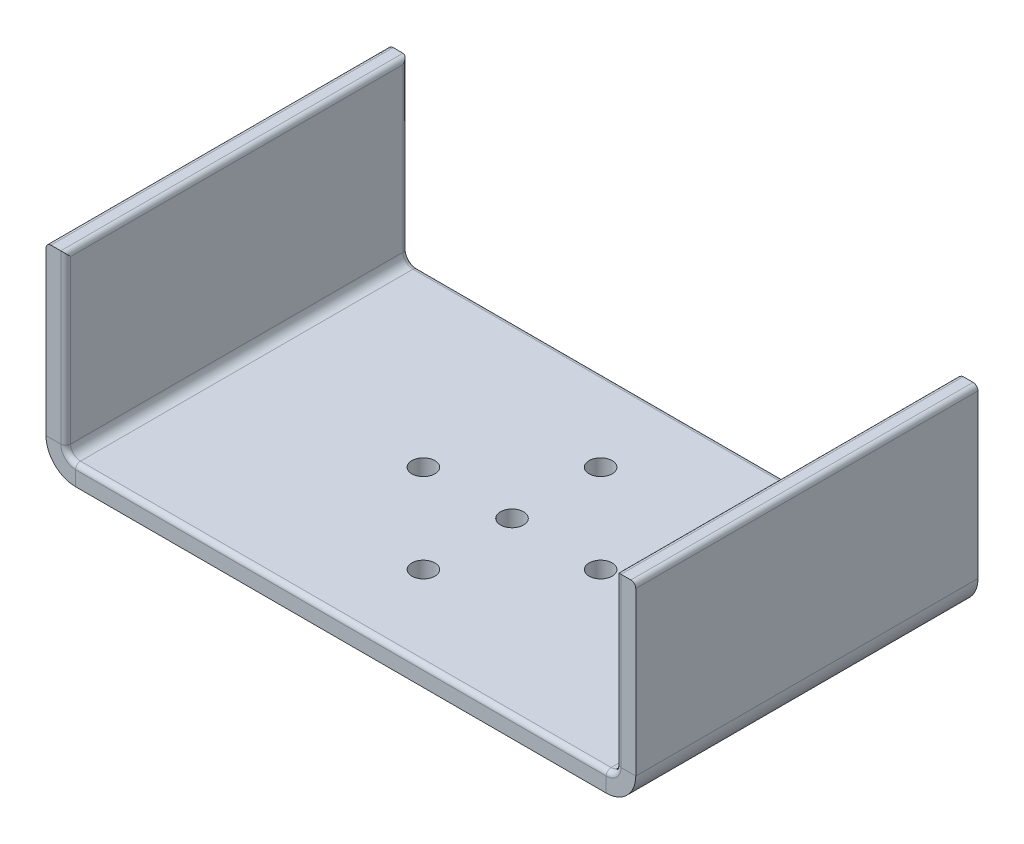
ISO-10303-21;
HEADER;
FILE_DESCRIPTION(('STEP AP214'),'2;1');
FILE_NAME('part.step','',(''),(''),'','','');
FILE_SCHEMA(('AUTOMOTIVE_DESIGN { 1 0 10303 214 1 1 1 1 }'));
ENDSEC;
DATA;
#1=APPLICATION_CONTEXT('core data for automotive mechanical design processes');
#2=APPLICATION_PROTOCOL_DEFINITION('international standard','automotive_design',2000,#1);
#3=PRODUCT_CONTEXT('',#1,'mechanical');
#4=PRODUCT('Part','Part','',(#3));
#5=PRODUCT_RELATED_PRODUCT_CATEGORY('part','',(#4));
#6=PRODUCT_DEFINITION_FORMATION('','',#4);
#7=PRODUCT_DEFINITION_CONTEXT('part definition',#1,'design');
#8=PRODUCT_DEFINITION('design','',#6,#7);
#9=PRODUCT_DEFINITION_SHAPE('','',#8);
#10=(LENGTH_UNIT() NAMED_UNIT(*) SI_UNIT(.MILLI.,.METRE.));
#11=(NAMED_UNIT(*) PLANE_ANGLE_UNIT() SI_UNIT($,.RADIAN.));
#12=(NAMED_UNIT(*) SI_UNIT($,.STERADIAN.) SOLID_ANGLE_UNIT());
#13=UNCERTAINTY_MEASURE_WITH_UNIT(LENGTH_MEASURE(1.E-05),#10,'distance_accuracy_value','');
#14=(GEOMETRIC_REPRESENTATION_CONTEXT(3) GLOBAL_UNCERTAINTY_ASSIGNED_CONTEXT((#13)) GLOBAL_UNIT_ASSIGNED_CONTEXT((#10,
#11,#12)) REPRESENTATION_CONTEXT('',''));
#15=CARTESIAN_POINT('',(0.,0.,0.));
#16=DIRECTION('',(0.,0.,1.));
#17=DIRECTION('',(1.,0.,0.));
#18=AXIS2_PLACEMENT_3D('',#15,#16,#17);
#19=CARTESIAN_POINT('',(0.,-2.,0.));
#20=DIRECTION('',(0.,1.,0.));
#21=DIRECTION('',(0.,0.,1.));
#22=AXIS2_PLACEMENT_3D('',#19,#20,#21);
#23=PLANE('',#22);
#24=CARTESIAN_POINT('',(-9.,-2.,0.));
#25=DIRECTION('',(0.,1.,0.));
#26=DIRECTION('',(0.,0.,1.));
#27=AXIS2_PLACEMENT_3D('',#24,#25,#26);
#28=CIRCLE('',#27,1.17000000000009);
#29=CARTESIAN_POINT('',(-9.,-2.,1.17000000000009));
#30=VERTEX_POINT('',#29);
#31=EDGE_CURVE('E824',#30,#30,#28,.T.);
#32=ORIENTED_EDGE('',*,*,#31,.T.);
#33=EDGE_LOOP('',(#32));
#34=FACE_BOUND('',#33,.T.);
#35=CARTESIAN_POINT('',(0.,-2.,9.));
#36=DIRECTION('',(0.,1.,0.));
#37=DIRECTION('',(0.,0.,1.));
#38=AXIS2_PLACEMENT_3D('',#35,#36,#37);
#39=CIRCLE('',#38,1.17000000000006);
#40=CARTESIAN_POINT('',(0.,-2.,10.1700000000001));
#41=VERTEX_POINT('',#40);
#42=EDGE_CURVE('E826',#41,#41,#39,.T.);
#43=ORIENTED_EDGE('',*,*,#42,.T.);
#44=EDGE_LOOP('',(#43));
#45=FACE_BOUND('',#44,.T.);
#46=CARTESIAN_POINT('',(9.,-2.,0.));
#47=DIRECTION('',(0.,1.,0.));
#48=DIRECTION('',(0.,0.,1.));
#49=AXIS2_PLACEMENT_3D('',#46,#47,#48);
#50=CIRCLE('',#49,1.17000000000003);
#51=CARTESIAN_POINT('',(9.,-2.,1.17000000000003));
#52=VERTEX_POINT('',#51);
#53=EDGE_CURVE('E831',#52,#52,#50,.T.);
#54=ORIENTED_EDGE('',*,*,#53,.T.);
#55=EDGE_LOOP('',(#54));
#56=FACE_BOUND('',#55,.T.);
#57=CARTESIAN_POINT('',(0.,-2.,-9.));
#58=DIRECTION('',(0.,1.,0.));
#59=DIRECTION('',(0.,0.,1.));
#60=AXIS2_PLACEMENT_3D('',#57,#58,#59);
#61=CIRCLE('',#60,1.17);
#62=CARTESIAN_POINT('',(0.,-2.,-7.83));
#63=VERTEX_POINT('',#62);
#64=EDGE_CURVE('E841',#63,#63,#61,.T.);
#65=ORIENTED_EDGE('',*,*,#64,.T.);
#66=EDGE_LOOP('',(#65));
#67=FACE_BOUND('',#66,.T.);
#68=CARTESIAN_POINT('',(0.,-2.,0.));
#69=DIRECTION('',(0.,1.,0.));
#70=DIRECTION('',(0.,0.,1.));
#71=AXIS2_PLACEMENT_3D('',#68,#69,#70);
#72=CIRCLE('',#71,1.17);
#73=CARTESIAN_POINT('',(0.,-2.,1.17));
#74=VERTEX_POINT('',#73);
#75=EDGE_CURVE('E380',#74,#74,#72,.T.);
#76=ORIENTED_EDGE('',*,*,#75,.T.);
#77=EDGE_LOOP('',(#76));
#78=FACE_BOUND('',#77,.T.);
#79=DIRECTION('',(0.,0.,-1.));
#80=VECTOR('',#79,1.);
#81=CARTESIAN_POINT('',(26.95,-2.00000000000001,-17.38));
#82=LINE('',#81,#80);
#83=CARTESIAN_POINT('',(26.95,-2.00000000000001,-17.38));
#84=VERTEX_POINT('',#83);
#85=CARTESIAN_POINT('',(26.95,-2.,17.38));
#86=VERTEX_POINT('',#85);
#87=EDGE_CURVE('E240',#84,#86,#82,.F.);
#88=ORIENTED_EDGE('',*,*,#87,.T.);
#89=DIRECTION('',(1.,0.,0.));
#90=VECTOR('',#89,1.);
#91=CARTESIAN_POINT('',(-29.95,-2.,17.38));
#92=LINE('',#91,#90);
#93=CARTESIAN_POINT('',(-26.95,-2.,17.38));
#94=VERTEX_POINT('',#93);
#95=EDGE_CURVE('E309',#94,#86,#92,.T.);
#96=ORIENTED_EDGE('',*,*,#95,.F.);
#97=DIRECTION('',(0.,0.,1.));
#98=VECTOR('',#97,1.);
#99=CARTESIAN_POINT('',(-26.95,-2.,17.38));
#100=LINE('',#99,#98);
#101=CARTESIAN_POINT('',(-26.95,-2.,-17.38));
#102=VERTEX_POINT('',#101);
#103=EDGE_CURVE('E295',#94,#102,#100,.F.);
#104=ORIENTED_EDGE('',*,*,#103,.T.);
#105=DIRECTION('',(-1.,0.,0.));
#106=VECTOR('',#105,1.);
#107=CARTESIAN_POINT('',(-29.95,-2.,-17.38));
#108=LINE('',#107,#106);
#109=EDGE_CURVE('E313',#84,#102,#108,.T.);
#110=ORIENTED_EDGE('',*,*,#109,.F.);
#111=EDGE_LOOP('',(#88,#96,#104,#110));
#112=FACE_BOUND('',#111,.T.);
#113=ADVANCED_FACE('F80',(#34,#45,#56,#67,#78,#112),#23,.F.);
#114=CARTESIAN_POINT('',(0.,0.,0.));
#115=DIRECTION('',(0.,1.,0.));
#116=DIRECTION('',(0.,0.,1.));
#117=AXIS2_PLACEMENT_3D('',#114,#115,#116);
#118=PLANE('',#117);
#119=CARTESIAN_POINT('',(-9.,0.,0.));
#120=DIRECTION('',(0.,1.,0.));
#121=DIRECTION('',(0.,0.,1.));
#122=AXIS2_PLACEMENT_3D('',#119,#120,#121);
#123=CIRCLE('',#122,1.17000000000009);
#124=CARTESIAN_POINT('',(-9.,0.,1.17000000000009));
#125=VERTEX_POINT('',#124);
#126=EDGE_CURVE('E822',#125,#125,#123,.T.);
#127=ORIENTED_EDGE('',*,*,#126,.F.);
#128=EDGE_LOOP('',(#127));
#129=FACE_BOUND('',#128,.T.);
#130=CARTESIAN_POINT('',(0.,0.,9.));
#131=DIRECTION('',(0.,1.,0.));
#132=DIRECTION('',(0.,0.,1.));
#133=AXIS2_PLACEMENT_3D('',#130,#131,#132);
#134=CIRCLE('',#133,1.17000000000006);
#135=CARTESIAN_POINT('',(0.,0.,10.1700000000001));
#136=VERTEX_POINT('',#135);
#137=EDGE_CURVE('E848',#136,#136,#134,.T.);
#138=ORIENTED_EDGE('',*,*,#137,.F.);
#139=EDGE_LOOP('',(#138));
#140=FACE_BOUND('',#139,.T.);
#141=CARTESIAN_POINT('',(9.,0.,0.));
#142=DIRECTION('',(0.,1.,0.));
#143=DIRECTION('',(0.,0.,1.));
#144=AXIS2_PLACEMENT_3D('',#141,#142,#143);
#145=CIRCLE('',#144,1.17000000000003);
#146=CARTESIAN_POINT('',(9.,0.,1.17000000000003));
#147=VERTEX_POINT('',#146);
#148=EDGE_CURVE('E845',#147,#147,#145,.T.);
#149=ORIENTED_EDGE('',*,*,#148,.F.);
#150=EDGE_LOOP('',(#149));
#151=FACE_BOUND('',#150,.T.);
#152=CARTESIAN_POINT('',(0.,0.,-9.));
#153=DIRECTION('',(0.,1.,0.));
#154=DIRECTION('',(0.,0.,1.));
#155=AXIS2_PLACEMENT_3D('',#152,#153,#154);
#156=CIRCLE('',#155,1.17);
#157=CARTESIAN_POINT('',(0.,0.,-7.83));
#158=VERTEX_POINT('',#157);
#159=EDGE_CURVE('E844',#158,#158,#156,.T.);
#160=ORIENTED_EDGE('',*,*,#159,.F.);
#161=EDGE_LOOP('',(#160));
#162=FACE_BOUND('',#161,.T.);
#163=CARTESIAN_POINT('',(0.,0.,0.));
#164=DIRECTION('',(0.,1.,0.));
#165=DIRECTION('',(0.,0.,1.));
#166=AXIS2_PLACEMENT_3D('',#163,#164,#165);
#167=CIRCLE('',#166,1.17);
#168=CARTESIAN_POINT('',(0.,0.,1.17));
#169=VERTEX_POINT('',#168);
#170=EDGE_CURVE('E825',#169,#169,#167,.T.);
#171=ORIENTED_EDGE('',*,*,#170,.F.);
#172=EDGE_LOOP('',(#171));
#173=FACE_BOUND('',#172,.T.);
#174=DIRECTION('',(0.,0.,-1.));
#175=VECTOR('',#174,1.);
#176=CARTESIAN_POINT('',(26.95,0.,-17.38));
#177=LINE('',#176,#175);
#178=CARTESIAN_POINT('',(26.95,0.,-16.88));
#179=VERTEX_POINT('',#178);
#180=CARTESIAN_POINT('',(26.95,0.,16.88));
#181=VERTEX_POINT('',#180);
#182=EDGE_CURVE('E241',#179,#181,#177,.F.);
#183=ORIENTED_EDGE('',*,*,#182,.F.);
#184=DIRECTION('',(-1.,0.,0.));
#185=VECTOR('',#184,1.);
#186=CARTESIAN_POINT('',(0.,0.,-16.88));
#187=LINE('',#186,#185);
#188=CARTESIAN_POINT('',(-26.95,0.,-16.88));
#189=VERTEX_POINT('',#188);
#190=EDGE_CURVE('E336',#179,#189,#187,.T.);
#191=ORIENTED_EDGE('',*,*,#190,.T.);
#192=DIRECTION('',(0.,0.,1.));
#193=VECTOR('',#192,1.);
#194=CARTESIAN_POINT('',(-26.95,0.,17.38));
#195=LINE('',#194,#193);
#196=CARTESIAN_POINT('',(-26.95,0.,16.88));
#197=VERTEX_POINT('',#196);
#198=EDGE_CURVE('E276',#197,#189,#195,.F.);
#199=ORIENTED_EDGE('',*,*,#198,.F.);
#200=DIRECTION('',(1.,0.,0.));
#201=VECTOR('',#200,1.);
#202=CARTESIAN_POINT('',(0.,0.,16.88));
#203=LINE('',#202,#201);
#204=EDGE_CURVE('E334',#197,#181,#203,.T.);
#205=ORIENTED_EDGE('',*,*,#204,.T.);
#206=EDGE_LOOP('',(#183,#191,#199,#205));
#207=FACE_BOUND('',#206,.T.);
#208=ADVANCED_FACE('F445',(#129,#140,#151,#162,#173,#207),#118,.T.);
#209=CARTESIAN_POINT('',(-29.95,-2.,-17.38));
#210=DIRECTION('',(0.,0.,-1.));
#211=DIRECTION('',(-1.,0.,0.));
#212=AXIS2_PLACEMENT_3D('',#209,#210,#211);
#213=PLANE('',#212);
#214=DIRECTION('',(0.,-1.,0.));
#215=VECTOR('',#214,1.);
#216=CARTESIAN_POINT('',(-26.95,0.,-17.38));
#217=LINE('',#216,#215);
#218=CARTESIAN_POINT('',(-26.95,-0.5,-17.38));
#219=VERTEX_POINT('',#218);
#220=EDGE_CURVE('E307',#219,#102,#217,.T.);
#221=ORIENTED_EDGE('',*,*,#220,.F.);
#222=DIRECTION('',(-1.,0.,0.));
#223=VECTOR('',#222,1.);
#224=CARTESIAN_POINT('',(-29.95,-0.5,-17.38));
#225=LINE('',#224,#223);
#226=CARTESIAN_POINT('',(26.95,-0.500000000000005,-17.38));
#227=VERTEX_POINT('',#226);
#228=EDGE_CURVE('E338',#219,#227,#225,.F.);
#229=ORIENTED_EDGE('',*,*,#228,.T.);
#230=DIRECTION('',(0.,-1.,0.));
#231=VECTOR('',#230,1.);
#232=CARTESIAN_POINT('',(26.95,0.,-17.38));
#233=LINE('',#232,#231);
#234=EDGE_CURVE('E265',#227,#84,#233,.T.);
#235=ORIENTED_EDGE('',*,*,#234,.T.);
#236=ORIENTED_EDGE('',*,*,#109,.T.);
#237=EDGE_LOOP('',(#221,#229,#235,#236));
#238=FACE_BOUND('',#237,.T.);
#239=ADVANCED_FACE('F491',(#238),#213,.T.);
#240=CARTESIAN_POINT('',(-29.95,-2.,17.38));
#241=DIRECTION('',(0.,0.,1.));
#242=DIRECTION('',(1.,0.,0.));
#243=AXIS2_PLACEMENT_3D('',#240,#241,#242);
#244=PLANE('',#243);
#245=DIRECTION('',(0.,-1.,0.));
#246=VECTOR('',#245,1.);
#247=CARTESIAN_POINT('',(26.95,0.,17.38));
#248=LINE('',#247,#246);
#249=CARTESIAN_POINT('',(26.95,-0.5,17.38));
#250=VERTEX_POINT('',#249);
#251=EDGE_CURVE('E269',#250,#86,#248,.T.);
#252=ORIENTED_EDGE('',*,*,#251,.F.);
#253=DIRECTION('',(1.,0.,0.));
#254=VECTOR('',#253,1.);
#255=CARTESIAN_POINT('',(-29.95,-0.5,17.38));
#256=LINE('',#255,#254);
#257=CARTESIAN_POINT('',(-26.95,-0.5,17.38));
#258=VERTEX_POINT('',#257);
#259=EDGE_CURVE('E13',#250,#258,#256,.F.);
#260=ORIENTED_EDGE('',*,*,#259,.T.);
#261=DIRECTION('',(0.,-1.,0.));
#262=VECTOR('',#261,1.);
#263=CARTESIAN_POINT('',(-26.95,0.,17.38));
#264=LINE('',#263,#262);
#265=EDGE_CURVE('E302',#258,#94,#264,.T.);
#266=ORIENTED_EDGE('',*,*,#265,.T.);
#267=ORIENTED_EDGE('',*,*,#95,.T.);
#268=EDGE_LOOP('',(#252,#260,#266,#267));
#269=FACE_BOUND('',#268,.T.);
#270=ADVANCED_FACE('F502',(#269),#244,.T.);
#271=CARTESIAN_POINT('',(-26.95,1.,-17.38));
#272=DIRECTION('',(0.,0.,-1.));
#273=DIRECTION('',(-1.,0.,0.));
#274=AXIS2_PLACEMENT_3D('',#271,#272,#273);
#275=PLANE('',#274);
#276=DIRECTION('',(1.,0.,0.));
#277=VECTOR('',#276,1.);
#278=CARTESIAN_POINT('',(-29.95,0.99999999999999,-17.38));
#279=LINE('',#278,#277);
#280=CARTESIAN_POINT('',(-28.45,0.999999999999996,-17.38));
#281=VERTEX_POINT('',#280);
#282=CARTESIAN_POINT('',(-29.95,0.99999999999999,-17.38));
#283=VERTEX_POINT('',#282);
#284=EDGE_CURVE('E271',#281,#283,#279,.F.);
#285=ORIENTED_EDGE('',*,*,#284,.F.);
#286=CARTESIAN_POINT('',(-26.95,1.,-17.38));
#287=DIRECTION('',(0.,0.,-1.));
#288=DIRECTION('',(-1.,0.,0.));
#289=AXIS2_PLACEMENT_3D('',#286,#287,#288);
#290=CIRCLE('',#289,1.5);
#291=EDGE_CURVE('E332',#281,#219,#290,.F.);
#292=ORIENTED_EDGE('',*,*,#291,.T.);
#293=ORIENTED_EDGE('',*,*,#220,.T.);
#294=CARTESIAN_POINT('',(-26.95,1.,-17.38));
#295=DIRECTION('',(0.,0.,1.));
#296=DIRECTION('',(1.,0.,0.));
#297=AXIS2_PLACEMENT_3D('',#294,#295,#296);
#298=CIRCLE('',#297,3.);
#299=EDGE_CURVE('E298',#102,#283,#298,.F.);
#300=ORIENTED_EDGE('',*,*,#299,.T.);
#301=EDGE_LOOP('',(#285,#292,#293,#300));
#302=FACE_BOUND('',#301,.T.);
#303=ADVANCED_FACE('F486',(#302),#275,.T.);
#304=CARTESIAN_POINT('',(-26.95,1.,17.38));
#305=DIRECTION('',(0.,0.,-1.));
#306=DIRECTION('',(-1.,0.,0.));
#307=AXIS2_PLACEMENT_3D('',#304,#305,#306);
#308=PLANE('',#307);
#309=ORIENTED_EDGE('',*,*,#265,.F.);
#310=CARTESIAN_POINT('',(-26.95,1.,17.38));
#311=DIRECTION('',(0.,0.,-1.));
#312=DIRECTION('',(-1.,0.,0.));
#313=AXIS2_PLACEMENT_3D('',#310,#311,#312);
#314=CIRCLE('',#313,1.5);
#315=CARTESIAN_POINT('',(-28.45,0.999999999999996,17.38));
#316=VERTEX_POINT('',#315);
#317=EDGE_CURVE('E349',#258,#316,#314,.T.);
#318=ORIENTED_EDGE('',*,*,#317,.T.);
#319=DIRECTION('',(1.,0.,0.));
#320=VECTOR('',#319,1.);
#321=CARTESIAN_POINT('',(-27.95,0.999999999999997,17.38));
#322=LINE('',#321,#320);
#323=CARTESIAN_POINT('',(-29.95,0.99999999999999,17.38));
#324=VERTEX_POINT('',#323);
#325=EDGE_CURVE('E288',#316,#324,#322,.F.);
#326=ORIENTED_EDGE('',*,*,#325,.T.);
#327=CARTESIAN_POINT('',(-26.95,1.,17.38));
#328=DIRECTION('',(0.,0.,1.));
#329=DIRECTION('',(1.,0.,0.));
#330=AXIS2_PLACEMENT_3D('',#327,#328,#329);
#331=CIRCLE('',#330,3.);
#332=EDGE_CURVE('E299',#324,#94,#331,.T.);
#333=ORIENTED_EDGE('',*,*,#332,.T.);
#334=EDGE_LOOP('',(#309,#318,#326,#333));
#335=FACE_BOUND('',#334,.T.);
#336=ADVANCED_FACE('F496',(#335),#308,.F.);
#337=CARTESIAN_POINT('',(-26.95,1.,17.38));
#338=DIRECTION('',(0.,0.,1.));
#339=DIRECTION('',(-1.,0.,0.));
#340=AXIS2_PLACEMENT_3D('',#337,#338,#339);
#341=CYLINDRICAL_SURFACE('',#340,3.);
#342=ORIENTED_EDGE('',*,*,#103,.F.);
#343=ORIENTED_EDGE('',*,*,#332,.F.);
#344=DIRECTION('',(0.,0.,1.));
#345=VECTOR('',#344,1.);
#346=CARTESIAN_POINT('',(-29.95,0.99999999999999,-17.38));
#347=LINE('',#346,#345);
#348=EDGE_CURVE('E285',#324,#283,#347,.F.);
#349=ORIENTED_EDGE('',*,*,#348,.T.);
#350=ORIENTED_EDGE('',*,*,#299,.F.);
#351=EDGE_LOOP('',(#342,#343,#349,#350));
#352=FACE_BOUND('',#351,.T.);
#353=ADVANCED_FACE('F483',(#352),#341,.T.);
#354=CARTESIAN_POINT('',(-26.95,1.,17.38));
#355=DIRECTION('',(0.,0.,1.));
#356=DIRECTION('',(-1.,0.,0.));
#357=AXIS2_PLACEMENT_3D('',#354,#355,#356);
#358=CYLINDRICAL_SURFACE('',#357,1.);
#359=ORIENTED_EDGE('',*,*,#198,.T.);
#360=CARTESIAN_POINT('',(-26.95,1.,-16.88));
#361=DIRECTION('',(0.,0.,-1.));
#362=DIRECTION('',(-1.,0.,0.));
#363=AXIS2_PLACEMENT_3D('',#360,#361,#362);
#364=CIRCLE('',#363,1.);
#365=CARTESIAN_POINT('',(-27.95,0.999999999999997,-16.88));
#366=VERTEX_POINT('',#365);
#367=EDGE_CURVE('E330',#189,#366,#364,.T.);
#368=ORIENTED_EDGE('',*,*,#367,.T.);
#369=DIRECTION('',(0.,0.,1.));
#370=VECTOR('',#369,1.);
#371=CARTESIAN_POINT('',(-27.95,0.999999999999997,-17.38));
#372=LINE('',#371,#370);
#373=CARTESIAN_POINT('',(-27.95,0.999999999999997,16.88));
#374=VERTEX_POINT('',#373);
#375=EDGE_CURVE('E290',#366,#374,#372,.T.);
#376=ORIENTED_EDGE('',*,*,#375,.T.);
#377=CARTESIAN_POINT('',(-26.95,1.,16.88));
#378=DIRECTION('',(0.,0.,-1.));
#379=DIRECTION('',(-1.,0.,0.));
#380=AXIS2_PLACEMENT_3D('',#377,#378,#379);
#381=CIRCLE('',#380,1.);
#382=EDGE_CURVE('E328',#374,#197,#381,.F.);
#383=ORIENTED_EDGE('',*,*,#382,.T.);
#384=EDGE_LOOP('',(#359,#368,#376,#383));
#385=FACE_BOUND('',#384,.T.);
#386=ADVANCED_FACE('F448',(#385),#358,.F.);
#387=CARTESIAN_POINT('',(-29.9500000000001,18.,17.38));
#388=DIRECTION('',(0.,0.,-1.));
#389=DIRECTION('',(-1.,0.,0.));
#390=AXIS2_PLACEMENT_3D('',#387,#388,#389);
#391=PLANE('',#390);
#392=ORIENTED_EDGE('',*,*,#325,.F.);
#393=DIRECTION('',(0.,1.,0.));
#394=VECTOR('',#393,1.);
#395=CARTESIAN_POINT('',(-28.4500000000001,18.,17.38));
#396=LINE('',#395,#394);
#397=CARTESIAN_POINT('',(-28.4500000000001,18.,17.38));
#398=VERTEX_POINT('',#397);
#399=EDGE_CURVE('E347',#316,#398,#396,.T.);
#400=ORIENTED_EDGE('',*,*,#399,.T.);
#401=DIRECTION('',(1.,0.,0.));
#402=VECTOR('',#401,1.);
#403=CARTESIAN_POINT('',(-29.9500000000001,18.,17.38));
#404=LINE('',#403,#402);
#405=CARTESIAN_POINT('',(-29.4500000000001,18.,17.38));
#406=VERTEX_POINT('',#405);
#407=EDGE_CURVE('E273',#406,#398,#404,.T.);
#408=ORIENTED_EDGE('',*,*,#407,.F.);
#409=CARTESIAN_POINT('',(-29.4500000000001,17.5,17.38));
#410=DIRECTION('',(0.,0.,-1.));
#411=DIRECTION('',(-1.,0.,0.));
#412=AXIS2_PLACEMENT_3D('',#409,#410,#411);
#413=CIRCLE('',#412,0.5);
#414=CARTESIAN_POINT('',(-29.9500000000001,17.5,17.38));
#415=VERTEX_POINT('',#414);
#416=EDGE_CURVE('E345',#406,#415,#413,.F.);
#417=ORIENTED_EDGE('',*,*,#416,.T.);
#418=DIRECTION('',(0.,1.,0.));
#419=VECTOR('',#418,1.);
#420=CARTESIAN_POINT('',(-29.95,-1.10892898888697E-13,17.38));
#421=LINE('',#420,#419);
#422=EDGE_CURVE('E282',#324,#415,#421,.T.);
#423=ORIENTED_EDGE('',*,*,#422,.F.);
#424=EDGE_LOOP('',(#392,#400,#408,#417,#423));
#425=FACE_BOUND('',#424,.T.);
#426=ADVANCED_FACE('F465',(#425),#391,.F.);
#427=CARTESIAN_POINT('',(-29.95,0.,-17.38));
#428=DIRECTION('',(0.,0.,1.));
#429=DIRECTION('',(1.,0.,0.));
#430=AXIS2_PLACEMENT_3D('',#427,#428,#429);
#431=PLANE('',#430);
#432=DIRECTION('',(1.,0.,0.));
#433=VECTOR('',#432,1.);
#434=CARTESIAN_POINT('',(-29.9500000000001,18.,-17.38));
#435=LINE('',#434,#433);
#436=CARTESIAN_POINT('',(-29.4500000000001,18.,-17.38));
#437=VERTEX_POINT('',#436);
#438=CARTESIAN_POINT('',(-28.4500000000001,18.,-17.38));
#439=VERTEX_POINT('',#438);
#440=EDGE_CURVE('E277',#437,#439,#435,.T.);
#441=ORIENTED_EDGE('',*,*,#440,.T.);
#442=DIRECTION('',(0.,-1.,0.));
#443=VECTOR('',#442,1.);
#444=CARTESIAN_POINT('',(-28.45,0.999999999999996,-17.38));
#445=LINE('',#444,#443);
#446=EDGE_CURVE('E318',#439,#281,#445,.T.);
#447=ORIENTED_EDGE('',*,*,#446,.T.);
#448=ORIENTED_EDGE('',*,*,#284,.T.);
#449=DIRECTION('',(0.,-1.,0.));
#450=VECTOR('',#449,1.);
#451=CARTESIAN_POINT('',(-29.95,-1.10892898888697E-13,-17.38));
#452=LINE('',#451,#450);
#453=CARTESIAN_POINT('',(-29.9500000000001,17.5,-17.38));
#454=VERTEX_POINT('',#453);
#455=EDGE_CURVE('E280',#454,#283,#452,.T.);
#456=ORIENTED_EDGE('',*,*,#455,.F.);
#457=CARTESIAN_POINT('',(-29.4500000000001,17.5,-17.38));
#458=DIRECTION('',(0.,0.,1.));
#459=DIRECTION('',(1.,0.,0.));
#460=AXIS2_PLACEMENT_3D('',#457,#458,#459);
#461=CIRCLE('',#460,0.5);
#462=EDGE_CURVE('E316',#454,#437,#461,.F.);
#463=ORIENTED_EDGE('',*,*,#462,.T.);
#464=EDGE_LOOP('',(#441,#447,#448,#456,#463));
#465=FACE_BOUND('',#464,.T.);
#466=ADVANCED_FACE('F593',(#465),#431,.F.);
#467=CARTESIAN_POINT('',(-29.95,-1.10892898888697E-13,0.));
#468=DIRECTION('',(1.,0.,0.));
#469=DIRECTION('',(0.,1.,0.));
#470=AXIS2_PLACEMENT_3D('',#467,#468,#469);
#471=PLANE('',#470);
#472=ORIENTED_EDGE('',*,*,#422,.T.);
#473=DIRECTION('',(0.,0.,-1.));
#474=VECTOR('',#473,1.);
#475=CARTESIAN_POINT('',(-29.9500000000001,17.5,0.));
#476=LINE('',#475,#474);
#477=EDGE_CURVE('E373',#415,#454,#476,.T.);
#478=ORIENTED_EDGE('',*,*,#477,.T.);
#479=ORIENTED_EDGE('',*,*,#455,.T.);
#480=ORIENTED_EDGE('',*,*,#348,.F.);
#481=EDGE_LOOP('',(#472,#478,#479,#480));
#482=FACE_BOUND('',#481,.T.);
#483=ADVANCED_FACE('F477',(#482),#471,.F.);
#484=CARTESIAN_POINT('',(-27.95,-1.03909936211011E-13,0.));
#485=DIRECTION('',(1.,0.,0.));
#486=DIRECTION('',(0.,1.,0.));
#487=AXIS2_PLACEMENT_3D('',#484,#485,#486);
#488=PLANE('',#487);
#489=ORIENTED_EDGE('',*,*,#375,.F.);
#490=DIRECTION('',(0.,-1.,0.));
#491=VECTOR('',#490,1.);
#492=CARTESIAN_POINT('',(-27.9500000000001,18.,-16.88));
#493=LINE('',#492,#491);
#494=CARTESIAN_POINT('',(-27.9500000000001,17.5,-16.88));
#495=VERTEX_POINT('',#494);
#496=EDGE_CURVE('E325',#366,#495,#493,.F.);
#497=ORIENTED_EDGE('',*,*,#496,.T.);
#498=DIRECTION('',(0.,0.,-1.));
#499=VECTOR('',#498,1.);
#500=CARTESIAN_POINT('',(-27.9500000000001,17.5,17.38));
#501=LINE('',#500,#499);
#502=CARTESIAN_POINT('',(-27.9500000000001,17.5,16.88));
#503=VERTEX_POINT('',#502);
#504=EDGE_CURVE('E321',#495,#503,#501,.F.);
#505=ORIENTED_EDGE('',*,*,#504,.T.);
#506=DIRECTION('',(0.,1.,0.));
#507=VECTOR('',#506,1.);
#508=CARTESIAN_POINT('',(-27.95,0.999999999999996,16.88));
#509=LINE('',#508,#507);
#510=EDGE_CURVE('E323',#503,#374,#509,.F.);
#511=ORIENTED_EDGE('',*,*,#510,.T.);
#512=EDGE_LOOP('',(#489,#497,#505,#511));
#513=FACE_BOUND('',#512,.T.);
#514=ADVANCED_FACE('F592',(#513),#488,.T.);
#515=CARTESIAN_POINT('',(-29.9500000000001,18.,-17.38));
#516=DIRECTION('',(0.,-1.,0.));
#517=DIRECTION('',(1.,0.,0.));
#518=AXIS2_PLACEMENT_3D('',#515,#516,#517);
#519=PLANE('',#518);
#520=ORIENTED_EDGE('',*,*,#407,.T.);
#521=DIRECTION('',(0.,0.,-1.));
#522=VECTOR('',#521,1.);
#523=CARTESIAN_POINT('',(-28.4500000000001,18.,-17.38));
#524=LINE('',#523,#522);
#525=EDGE_CURVE('E371',#398,#439,#524,.T.);
#526=ORIENTED_EDGE('',*,*,#525,.T.);
#527=ORIENTED_EDGE('',*,*,#440,.F.);
#528=DIRECTION('',(0.,0.,-1.));
#529=VECTOR('',#528,1.);
#530=CARTESIAN_POINT('',(-29.4500000000001,18.,-17.38));
#531=LINE('',#530,#529);
#532=EDGE_CURVE('E369',#437,#406,#531,.F.);
#533=ORIENTED_EDGE('',*,*,#532,.T.);
#534=EDGE_LOOP('',(#520,#526,#527,#533));
#535=FACE_BOUND('',#534,.T.);
#536=ADVANCED_FACE('F469',(#535),#519,.F.);
#537=CARTESIAN_POINT('',(26.95,0.999999999999999,17.38));
#538=DIRECTION('',(0.,0.,1.));
#539=DIRECTION('',(1.,0.,0.));
#540=AXIS2_PLACEMENT_3D('',#537,#538,#539);
#541=PLANE('',#540);
#542=DIRECTION('',(-1.,0.,0.));
#543=VECTOR('',#542,1.);
#544=CARTESIAN_POINT('',(29.95,0.99999999999999,17.38));
#545=LINE('',#544,#543);
#546=CARTESIAN_POINT('',(28.45,0.999999999999996,17.38));
#547=VERTEX_POINT('',#546);
#548=CARTESIAN_POINT('',(29.95,0.999999999999989,17.38));
#549=VERTEX_POINT('',#548);
#550=EDGE_CURVE('E261',#547,#549,#545,.F.);
#551=ORIENTED_EDGE('',*,*,#550,.F.);
#552=CARTESIAN_POINT('',(26.95,0.999999999999999,17.38));
#553=DIRECTION('',(0.,0.,1.));
#554=DIRECTION('',(1.,0.,0.));
#555=AXIS2_PLACEMENT_3D('',#552,#553,#554);
#556=CIRCLE('',#555,1.5);
#557=EDGE_CURVE('E351',#547,#250,#556,.F.);
#558=ORIENTED_EDGE('',*,*,#557,.T.);
#559=ORIENTED_EDGE('',*,*,#251,.T.);
#560=CARTESIAN_POINT('',(26.95,0.999999999999999,17.38));
#561=DIRECTION('',(0.,0.,-1.));
#562=DIRECTION('',(-1.,0.,0.));
#563=AXIS2_PLACEMENT_3D('',#560,#561,#562);
#564=CIRCLE('',#563,3.);
#565=EDGE_CURVE('E264',#86,#549,#564,.F.);
#566=ORIENTED_EDGE('',*,*,#565,.T.);
#567=EDGE_LOOP('',(#551,#558,#559,#566));
#568=FACE_BOUND('',#567,.T.);
#569=ADVANCED_FACE('F505',(#568),#541,.T.);
#570=CARTESIAN_POINT('',(26.95,0.999999999999999,-17.38));
#571=DIRECTION('',(0.,0.,1.));
#572=DIRECTION('',(1.,0.,0.));
#573=AXIS2_PLACEMENT_3D('',#570,#571,#572);
#574=PLANE('',#573);
#575=ORIENTED_EDGE('',*,*,#234,.F.);
#576=CARTESIAN_POINT('',(26.95,0.999999999999999,-17.38));
#577=DIRECTION('',(0.,0.,1.));
#578=DIRECTION('',(1.,0.,0.));
#579=AXIS2_PLACEMENT_3D('',#576,#577,#578);
#580=CIRCLE('',#579,1.5);
#581=CARTESIAN_POINT('',(28.45,0.999999999999992,-17.38));
#582=VERTEX_POINT('',#581);
#583=EDGE_CURVE('E227',#227,#582,#580,.T.);
#584=ORIENTED_EDGE('',*,*,#583,.T.);
#585=DIRECTION('',(-1.,0.,0.));
#586=VECTOR('',#585,1.);
#587=CARTESIAN_POINT('',(27.95,0.999999999999994,-17.38));
#588=LINE('',#587,#586);
#589=CARTESIAN_POINT('',(29.95,0.999999999999987,-17.38));
#590=VERTEX_POINT('',#589);
#591=EDGE_CURVE('E221',#582,#590,#588,.F.);
#592=ORIENTED_EDGE('',*,*,#591,.T.);
#593=CARTESIAN_POINT('',(26.95,0.999999999999999,-17.38));
#594=DIRECTION('',(0.,0.,-1.));
#595=DIRECTION('',(-1.,0.,0.));
#596=AXIS2_PLACEMENT_3D('',#593,#594,#595);
#597=CIRCLE('',#596,3.);
#598=EDGE_CURVE('E225',#590,#84,#597,.T.);
#599=ORIENTED_EDGE('',*,*,#598,.T.);
#600=EDGE_LOOP('',(#575,#584,#592,#599));
#601=FACE_BOUND('',#600,.T.);
#602=ADVANCED_FACE('F224',(#601),#574,.F.);
#603=CARTESIAN_POINT('',(26.95,0.999999999999999,-17.38));
#604=DIRECTION('',(0.,0.,-1.));
#605=DIRECTION('',(1.,0.,0.));
#606=AXIS2_PLACEMENT_3D('',#603,#604,#605);
#607=CYLINDRICAL_SURFACE('',#606,3.);
#608=ORIENTED_EDGE('',*,*,#87,.F.);
#609=ORIENTED_EDGE('',*,*,#598,.F.);
#610=DIRECTION('',(0.,0.,-1.));
#611=VECTOR('',#610,1.);
#612=CARTESIAN_POINT('',(29.95,0.99999999999999,17.38));
#613=LINE('',#612,#611);
#614=EDGE_CURVE('E229',#590,#549,#613,.F.);
#615=ORIENTED_EDGE('',*,*,#614,.T.);
#616=ORIENTED_EDGE('',*,*,#565,.F.);
#617=EDGE_LOOP('',(#608,#609,#615,#616));
#618=FACE_BOUND('',#617,.T.);
#619=ADVANCED_FACE('F236',(#618),#607,.T.);
#620=CARTESIAN_POINT('',(26.95,0.999999999999999,-17.38));
#621=DIRECTION('',(0.,0.,-1.));
#622=DIRECTION('',(1.,0.,0.));
#623=AXIS2_PLACEMENT_3D('',#620,#621,#622);
#624=CYLINDRICAL_SURFACE('',#623,1.);
#625=DIRECTION('',(0.,0.,-1.));
#626=VECTOR('',#625,1.);
#627=CARTESIAN_POINT('',(27.95,0.999999999999997,17.38));
#628=LINE('',#627,#626);
#629=CARTESIAN_POINT('',(27.95,0.999999999999997,16.88));
#630=VERTEX_POINT('',#629);
#631=CARTESIAN_POINT('',(27.95,0.999999999999994,-16.88));
#632=VERTEX_POINT('',#631);
#633=EDGE_CURVE('E230',#630,#632,#628,.T.);
#634=ORIENTED_EDGE('',*,*,#633,.T.);
#635=CARTESIAN_POINT('',(26.95,0.999999999999999,-16.88));
#636=DIRECTION('',(0.,0.,1.));
#637=DIRECTION('',(1.,0.,0.));
#638=AXIS2_PLACEMENT_3D('',#635,#636,#637);
#639=CIRCLE('',#638,1.);
#640=EDGE_CURVE('E342',#632,#179,#639,.F.);
#641=ORIENTED_EDGE('',*,*,#640,.T.);
#642=ORIENTED_EDGE('',*,*,#182,.T.);
#643=CARTESIAN_POINT('',(26.95,0.999999999999999,16.88));
#644=DIRECTION('',(0.,0.,1.));
#645=DIRECTION('',(1.,0.,0.));
#646=AXIS2_PLACEMENT_3D('',#643,#644,#645);
#647=CIRCLE('',#646,1.);
#648=EDGE_CURVE('E340',#181,#630,#647,.T.);
#649=ORIENTED_EDGE('',*,*,#648,.T.);
#650=EDGE_LOOP('',(#634,#641,#642,#649));
#651=FACE_BOUND('',#650,.T.);
#652=ADVANCED_FACE('F429',(#651),#624,.F.);
#653=CARTESIAN_POINT('',(29.95,0.,17.38));
#654=DIRECTION('',(0.,0.,-1.));
#655=DIRECTION('',(-1.,0.,0.));
#656=AXIS2_PLACEMENT_3D('',#653,#654,#655);
#657=PLANE('',#656);
#658=DIRECTION('',(-1.,0.,0.));
#659=VECTOR('',#658,1.);
#660=CARTESIAN_POINT('',(29.9500000000001,18.,17.38));
#661=LINE('',#660,#659);
#662=CARTESIAN_POINT('',(29.4500000000001,18.,17.38));
#663=VERTEX_POINT('',#662);
#664=CARTESIAN_POINT('',(28.4500000000001,18.,17.38));
#665=VERTEX_POINT('',#664);
#666=EDGE_CURVE('E251',#663,#665,#661,.T.);
#667=ORIENTED_EDGE('',*,*,#666,.T.);
#668=DIRECTION('',(0.,-1.,0.));
#669=VECTOR('',#668,1.);
#670=CARTESIAN_POINT('',(28.45,0.999999999999994,17.38));
#671=LINE('',#670,#669);
#672=EDGE_CURVE('E364',#665,#547,#671,.T.);
#673=ORIENTED_EDGE('',*,*,#672,.T.);
#674=ORIENTED_EDGE('',*,*,#550,.T.);
#675=DIRECTION('',(0.,-1.,0.));
#676=VECTOR('',#675,1.);
#677=CARTESIAN_POINT('',(29.95,-1.10892898888697E-13,17.38));
#678=LINE('',#677,#676);
#679=CARTESIAN_POINT('',(29.9500000000001,17.5,17.38));
#680=VERTEX_POINT('',#679);
#681=EDGE_CURVE('E247',#680,#549,#678,.T.);
#682=ORIENTED_EDGE('',*,*,#681,.F.);
#683=CARTESIAN_POINT('',(29.4500000000001,17.5,17.38));
#684=DIRECTION('',(0.,0.,-1.));
#685=DIRECTION('',(-1.,0.,0.));
#686=AXIS2_PLACEMENT_3D('',#683,#684,#685);
#687=CIRCLE('',#686,0.5);
#688=EDGE_CURVE('E105',#680,#663,#687,.F.);
#689=ORIENTED_EDGE('',*,*,#688,.T.);
#690=EDGE_LOOP('',(#667,#673,#674,#682,#689));
#691=FACE_BOUND('',#690,.T.);
#692=ADVANCED_FACE('F507',(#691),#657,.F.);
#693=CARTESIAN_POINT('',(29.9500000000001,18.,-17.38));
#694=DIRECTION('',(0.,0.,1.));
#695=DIRECTION('',(1.,0.,0.));
#696=AXIS2_PLACEMENT_3D('',#693,#694,#695);
#697=PLANE('',#696);
#698=ORIENTED_EDGE('',*,*,#591,.F.);
#699=DIRECTION('',(0.,1.,0.));
#700=VECTOR('',#699,1.);
#701=CARTESIAN_POINT('',(28.4500000000001,18.,-17.38));
#702=LINE('',#701,#700);
#703=CARTESIAN_POINT('',(28.4500000000001,18.,-17.38));
#704=VERTEX_POINT('',#703);
#705=EDGE_CURVE('E367',#582,#704,#702,.T.);
#706=ORIENTED_EDGE('',*,*,#705,.T.);
#707=DIRECTION('',(-1.,0.,0.));
#708=VECTOR('',#707,1.);
#709=CARTESIAN_POINT('',(29.9500000000001,18.,-17.38));
#710=LINE('',#709,#708);
#711=CARTESIAN_POINT('',(29.4500000000001,18.,-17.38));
#712=VERTEX_POINT('',#711);
#713=EDGE_CURVE('E254',#712,#704,#710,.T.);
#714=ORIENTED_EDGE('',*,*,#713,.F.);
#715=CARTESIAN_POINT('',(29.4500000000001,17.5,-17.38));
#716=DIRECTION('',(0.,0.,1.));
#717=DIRECTION('',(1.,0.,0.));
#718=AXIS2_PLACEMENT_3D('',#715,#716,#717);
#719=CIRCLE('',#718,0.5);
#720=CARTESIAN_POINT('',(29.9500000000001,17.5,-17.38));
#721=VERTEX_POINT('',#720);
#722=EDGE_CURVE('E97',#712,#721,#719,.F.);
#723=ORIENTED_EDGE('',*,*,#722,.T.);
#724=DIRECTION('',(0.,1.,0.));
#725=VECTOR('',#724,1.);
#726=CARTESIAN_POINT('',(29.95,-1.10892898888697E-13,-17.38));
#727=LINE('',#726,#725);
#728=EDGE_CURVE('E245',#590,#721,#727,.T.);
#729=ORIENTED_EDGE('',*,*,#728,.F.);
#730=EDGE_LOOP('',(#698,#706,#714,#723,#729));
#731=FACE_BOUND('',#730,.T.);
#732=ADVANCED_FACE('F250',(#731),#697,.F.);
#733=CARTESIAN_POINT('',(29.95,-1.10892898888697E-13,0.));
#734=DIRECTION('',(-1.,0.,0.));
#735=DIRECTION('',(0.,-1.,0.));
#736=AXIS2_PLACEMENT_3D('',#733,#734,#735);
#737=PLANE('',#736);
#738=ORIENTED_EDGE('',*,*,#728,.T.);
#739=DIRECTION('',(0.,0.,1.));
#740=VECTOR('',#739,1.);
#741=CARTESIAN_POINT('',(29.9500000000001,17.5,0.));
#742=LINE('',#741,#740);
#743=EDGE_CURVE('E89',#721,#680,#742,.T.);
#744=ORIENTED_EDGE('',*,*,#743,.T.);
#745=ORIENTED_EDGE('',*,*,#681,.T.);
#746=ORIENTED_EDGE('',*,*,#614,.F.);
#747=EDGE_LOOP('',(#738,#744,#745,#746));
#748=FACE_BOUND('',#747,.T.);
#749=ADVANCED_FACE('F244',(#748),#737,.F.);
#750=CARTESIAN_POINT('',(27.95,-1.03909936211011E-13,0.));
#751=DIRECTION('',(-1.,0.,0.));
#752=DIRECTION('',(0.,-1.,0.));
#753=AXIS2_PLACEMENT_3D('',#750,#751,#752);
#754=PLANE('',#753);
#755=ORIENTED_EDGE('',*,*,#633,.F.);
#756=DIRECTION('',(0.,-1.,0.));
#757=VECTOR('',#756,1.);
#758=CARTESIAN_POINT('',(27.9500000000001,18.,16.88));
#759=LINE('',#758,#757);
#760=CARTESIAN_POINT('',(27.9500000000001,17.5,16.88));
#761=VERTEX_POINT('',#760);
#762=EDGE_CURVE('E361',#630,#761,#759,.F.);
#763=ORIENTED_EDGE('',*,*,#762,.T.);
#764=DIRECTION('',(0.,0.,1.));
#765=VECTOR('',#764,1.);
#766=CARTESIAN_POINT('',(27.9500000000001,17.5,-17.38));
#767=LINE('',#766,#765);
#768=CARTESIAN_POINT('',(27.9500000000001,17.5,-16.88));
#769=VERTEX_POINT('',#768);
#770=EDGE_CURVE('E359',#761,#769,#767,.F.);
#771=ORIENTED_EDGE('',*,*,#770,.T.);
#772=DIRECTION('',(0.,1.,0.));
#773=VECTOR('',#772,1.);
#774=CARTESIAN_POINT('',(27.95,0.999999999999996,-16.88));
#775=LINE('',#774,#773);
#776=EDGE_CURVE('E357',#769,#632,#775,.F.);
#777=ORIENTED_EDGE('',*,*,#776,.T.);
#778=EDGE_LOOP('',(#755,#763,#771,#777));
#779=FACE_BOUND('',#778,.T.);
#780=ADVANCED_FACE('F424',(#779),#754,.T.);
#781=CARTESIAN_POINT('',(29.9500000000001,18.,17.38));
#782=DIRECTION('',(0.,-1.,0.));
#783=DIRECTION('',(1.,0.,0.));
#784=AXIS2_PLACEMENT_3D('',#781,#782,#783);
#785=PLANE('',#784);
#786=ORIENTED_EDGE('',*,*,#713,.T.);
#787=DIRECTION('',(0.,0.,1.));
#788=VECTOR('',#787,1.);
#789=CARTESIAN_POINT('',(28.4500000000001,18.,17.38));
#790=LINE('',#789,#788);
#791=EDGE_CURVE('E355',#704,#665,#790,.T.);
#792=ORIENTED_EDGE('',*,*,#791,.T.);
#793=ORIENTED_EDGE('',*,*,#666,.F.);
#794=DIRECTION('',(0.,0.,1.));
#795=VECTOR('',#794,1.);
#796=CARTESIAN_POINT('',(29.4500000000001,18.,17.38));
#797=LINE('',#796,#795);
#798=EDGE_CURVE('E353',#663,#712,#797,.F.);
#799=ORIENTED_EDGE('',*,*,#798,.T.);
#800=EDGE_LOOP('',(#786,#792,#793,#799));
#801=FACE_BOUND('',#800,.T.);
#802=ADVANCED_FACE('F511',(#801),#785,.F.);
#803=CARTESIAN_POINT('',(28.45,0.,16.88));
#804=DIRECTION('',(0.,1.,0.));
#805=DIRECTION('',(-1.,0.,0.));
#806=AXIS2_PLACEMENT_3D('',#803,#804,#805);
#807=CYLINDRICAL_SURFACE('',#806,0.5);
#808=CARTESIAN_POINT('',(28.4500000000001,17.5,16.88));
#809=DIRECTION('',(0.,0.707106781186547,-0.707106781186547));
#810=DIRECTION('',(0.,0.707106781186547,0.707106781186547));
#811=AXIS2_PLACEMENT_3D('',#808,#809,#810);
#812=ELLIPSE('',#811,0.707106781186547,0.5);
#813=EDGE_CURVE('E405',#761,#665,#812,.T.);
#814=ORIENTED_EDGE('',*,*,#813,.F.);
#815=ORIENTED_EDGE('',*,*,#762,.F.);
#816=CARTESIAN_POINT('',(28.45,0.999999999999996,16.88));
#817=DIRECTION('',(0.,-1.,0.));
#818=DIRECTION('',(1.,0.,0.));
#819=AXIS2_PLACEMENT_3D('',#816,#817,#818);
#820=CIRCLE('',#819,0.5);
#821=EDGE_CURVE('E84',#547,#630,#820,.T.);
#822=ORIENTED_EDGE('',*,*,#821,.F.);
#823=ORIENTED_EDGE('',*,*,#672,.F.);
#824=EDGE_LOOP('',(#814,#815,#822,#823));
#825=FACE_BOUND('',#824,.T.);
#826=ADVANCED_FACE('F421',(#825),#807,.T.);
#827=CARTESIAN_POINT('',(26.95,0.999999999999999,16.88));
#828=DIRECTION('',(0.,0.,1.));
#829=DIRECTION('',(1.,0.,0.));
#830=AXIS2_PLACEMENT_3D('',#827,#828,#829);
#831=TOROIDAL_SURFACE('',#830,1.5,0.5);
#832=ORIENTED_EDGE('',*,*,#821,.T.);
#833=ORIENTED_EDGE('',*,*,#648,.F.);
#834=CARTESIAN_POINT('',(26.95,-0.500000000000005,16.88));
#835=DIRECTION('',(-1.,0.,0.));
#836=DIRECTION('',(0.,0.,1.));
#837=AXIS2_PLACEMENT_3D('',#834,#835,#836);
#838=CIRCLE('',#837,0.5);
#839=EDGE_CURVE('E403',#250,#181,#838,.T.);
#840=ORIENTED_EDGE('',*,*,#839,.F.);
#841=ORIENTED_EDGE('',*,*,#557,.F.);
#842=EDGE_LOOP('',(#832,#833,#840,#841));
#843=FACE_BOUND('',#842,.T.);
#844=ADVANCED_FACE('F416',(#843),#831,.T.);
#845=CARTESIAN_POINT('',(28.4500000000001,17.5,17.38));
#846=DIRECTION('',(0.,0.,-1.));
#847=DIRECTION('',(-1.,0.,0.));
#848=AXIS2_PLACEMENT_3D('',#845,#846,#847);
#849=CYLINDRICAL_SURFACE('',#848,0.5);
#850=ORIENTED_EDGE('',*,*,#813,.T.);
#851=ORIENTED_EDGE('',*,*,#791,.F.);
#852=CARTESIAN_POINT('',(28.4500000000001,17.5,-16.88));
#853=DIRECTION('',(0.,-0.707106781186547,-0.707106781186547));
#854=DIRECTION('',(0.,-0.707106781186547,0.707106781186547));
#855=AXIS2_PLACEMENT_3D('',#852,#853,#854);
#856=ELLIPSE('',#855,0.707106781186547,0.5);
#857=EDGE_CURVE('E400',#769,#704,#856,.T.);
#858=ORIENTED_EDGE('',*,*,#857,.F.);
#859=ORIENTED_EDGE('',*,*,#770,.F.);
#860=EDGE_LOOP('',(#850,#851,#858,#859));
#861=FACE_BOUND('',#860,.T.);
#862=ADVANCED_FACE('F562',(#861),#849,.T.);
#863=CARTESIAN_POINT('',(0.,-0.5,16.88));
#864=DIRECTION('',(1.,0.,0.));
#865=DIRECTION('',(0.,0.,-1.));
#866=AXIS2_PLACEMENT_3D('',#863,#864,#865);
#867=CYLINDRICAL_SURFACE('',#866,0.5);
#868=ORIENTED_EDGE('',*,*,#839,.T.);
#869=ORIENTED_EDGE('',*,*,#204,.F.);
#870=CARTESIAN_POINT('',(-26.95,-0.5,16.88));
#871=DIRECTION('',(-1.,0.,0.));
#872=DIRECTION('',(0.,0.,1.));
#873=AXIS2_PLACEMENT_3D('',#870,#871,#872);
#874=CIRCLE('',#873,0.5);
#875=EDGE_CURVE('E397',#258,#197,#874,.T.);
#876=ORIENTED_EDGE('',*,*,#875,.F.);
#877=ORIENTED_EDGE('',*,*,#259,.F.);
#878=EDGE_LOOP('',(#868,#869,#876,#877));
#879=FACE_BOUND('',#878,.T.);
#880=ADVANCED_FACE('F500',(#879),#867,.T.);
#881=CARTESIAN_POINT('',(28.4500000000001,18.,-16.88));
#882=DIRECTION('',(0.,-1.,0.));
#883=DIRECTION('',(1.,0.,0.));
#884=AXIS2_PLACEMENT_3D('',#881,#882,#883);
#885=CYLINDRICAL_SURFACE('',#884,0.5);
#886=ORIENTED_EDGE('',*,*,#857,.T.);
#887=ORIENTED_EDGE('',*,*,#705,.F.);
#888=CARTESIAN_POINT('',(28.45,0.999999999999992,-16.88));
#889=DIRECTION('',(0.,-1.,0.));
#890=DIRECTION('',(1.,0.,0.));
#891=AXIS2_PLACEMENT_3D('',#888,#889,#890);
#892=CIRCLE('',#891,0.5);
#893=EDGE_CURVE('E394',#632,#582,#892,.T.);
#894=ORIENTED_EDGE('',*,*,#893,.F.);
#895=ORIENTED_EDGE('',*,*,#776,.F.);
#896=EDGE_LOOP('',(#886,#887,#894,#895));
#897=FACE_BOUND('',#896,.T.);
#898=ADVANCED_FACE('F433',(#897),#885,.T.);
#899=CARTESIAN_POINT('',(-26.95,1.,16.88));
#900=DIRECTION('',(0.,0.,-1.));
#901=DIRECTION('',(-1.,0.,0.));
#902=AXIS2_PLACEMENT_3D('',#899,#900,#901);
#903=TOROIDAL_SURFACE('',#902,1.5,0.5);
#904=ORIENTED_EDGE('',*,*,#875,.T.);
#905=ORIENTED_EDGE('',*,*,#382,.F.);
#906=CARTESIAN_POINT('',(-28.45,0.999999999999996,16.88));
#907=DIRECTION('',(0.,1.,0.));
#908=DIRECTION('',(-1.,0.,0.));
#909=AXIS2_PLACEMENT_3D('',#906,#907,#908);
#910=CIRCLE('',#909,0.5);
#911=EDGE_CURVE('E391',#316,#374,#910,.T.);
#912=ORIENTED_EDGE('',*,*,#911,.F.);
#913=ORIENTED_EDGE('',*,*,#317,.F.);
#914=EDGE_LOOP('',(#904,#905,#912,#913));
#915=FACE_BOUND('',#914,.T.);
#916=ADVANCED_FACE('F453',(#915),#903,.T.);
#917=CARTESIAN_POINT('',(26.95,0.999999999999999,-16.88));
#918=DIRECTION('',(0.,0.,1.));
#919=DIRECTION('',(1.,0.,0.));
#920=AXIS2_PLACEMENT_3D('',#917,#918,#919);
#921=TOROIDAL_SURFACE('',#920,1.5,0.5);
#922=ORIENTED_EDGE('',*,*,#893,.T.);
#923=ORIENTED_EDGE('',*,*,#583,.F.);
#924=CARTESIAN_POINT('',(26.95,-0.500000000000005,-16.88));
#925=DIRECTION('',(-1.,0.,0.));
#926=DIRECTION('',(0.,0.,1.));
#927=AXIS2_PLACEMENT_3D('',#924,#925,#926);
#928=CIRCLE('',#927,0.5);
#929=EDGE_CURVE('E388',#179,#227,#928,.T.);
#930=ORIENTED_EDGE('',*,*,#929,.F.);
#931=ORIENTED_EDGE('',*,*,#640,.F.);
#932=EDGE_LOOP('',(#922,#923,#930,#931));
#933=FACE_BOUND('',#932,.T.);
#934=ADVANCED_FACE('F436',(#933),#921,.T.);
#935=CARTESIAN_POINT('',(-28.4500000000001,18.,16.88));
#936=DIRECTION('',(0.,-1.,0.));
#937=DIRECTION('',(1.,0.,0.));
#938=AXIS2_PLACEMENT_3D('',#935,#936,#937);
#939=CYLINDRICAL_SURFACE('',#938,0.5);
#940=ORIENTED_EDGE('',*,*,#911,.T.);
#941=ORIENTED_EDGE('',*,*,#510,.F.);
#942=CARTESIAN_POINT('',(-28.4500000000001,17.5,16.88));
#943=DIRECTION('',(0.,-0.707106781186547,0.707106781186547));
#944=DIRECTION('',(0.,0.707106781186547,0.707106781186547));
#945=AXIS2_PLACEMENT_3D('',#942,#943,#944);
#946=ELLIPSE('',#945,0.707106781186547,0.5);
#947=EDGE_CURVE('E385',#398,#503,#946,.F.);
#948=ORIENTED_EDGE('',*,*,#947,.F.);
#949=ORIENTED_EDGE('',*,*,#399,.F.);
#950=EDGE_LOOP('',(#940,#941,#948,#949));
#951=FACE_BOUND('',#950,.T.);
#952=ADVANCED_FACE('F459',(#951),#939,.T.);
#953=CARTESIAN_POINT('',(0.,-0.5,-16.88));
#954=DIRECTION('',(-1.,0.,0.));
#955=DIRECTION('',(0.,0.,1.));
#956=AXIS2_PLACEMENT_3D('',#953,#954,#955);
#957=CYLINDRICAL_SURFACE('',#956,0.5);
#958=ORIENTED_EDGE('',*,*,#929,.T.);
#959=ORIENTED_EDGE('',*,*,#228,.F.);
#960=CARTESIAN_POINT('',(-26.95,-0.5,-16.88));
#961=DIRECTION('',(-1.,0.,0.));
#962=DIRECTION('',(0.,0.,1.));
#963=AXIS2_PLACEMENT_3D('',#960,#961,#962);
#964=CIRCLE('',#963,0.5);
#965=EDGE_CURVE('E382',#189,#219,#964,.T.);
#966=ORIENTED_EDGE('',*,*,#965,.F.);
#967=ORIENTED_EDGE('',*,*,#190,.F.);
#968=EDGE_LOOP('',(#958,#959,#966,#967));
#969=FACE_BOUND('',#968,.T.);
#970=ADVANCED_FACE('F441',(#969),#957,.T.);
#971=CARTESIAN_POINT('',(-28.4500000000001,17.5,-17.38));
#972=DIRECTION('',(0.,0.,1.));
#973=DIRECTION('',(1.,0.,0.));
#974=AXIS2_PLACEMENT_3D('',#971,#972,#973);
#975=CYLINDRICAL_SURFACE('',#974,0.5);
#976=ORIENTED_EDGE('',*,*,#947,.T.);
#977=ORIENTED_EDGE('',*,*,#504,.F.);
#978=CARTESIAN_POINT('',(-28.4500000000001,17.5,-16.88));
#979=DIRECTION('',(0.,0.707106781186547,0.707106781186547));
#980=DIRECTION('',(0.,-0.707106781186547,0.707106781186547));
#981=AXIS2_PLACEMENT_3D('',#978,#979,#980);
#982=ELLIPSE('',#981,0.707106781186547,0.5);
#983=EDGE_CURVE('E379',#439,#495,#982,.F.);
#984=ORIENTED_EDGE('',*,*,#983,.F.);
#985=ORIENTED_EDGE('',*,*,#525,.F.);
#986=EDGE_LOOP('',(#976,#977,#984,#985));
#987=FACE_BOUND('',#986,.T.);
#988=ADVANCED_FACE('F545',(#987),#975,.T.);
#989=CARTESIAN_POINT('',(-26.95,1.,-16.88));
#990=DIRECTION('',(0.,0.,-1.));
#991=DIRECTION('',(-1.,0.,0.));
#992=AXIS2_PLACEMENT_3D('',#989,#990,#991);
#993=TOROIDAL_SURFACE('',#992,1.5,0.5);
#994=ORIENTED_EDGE('',*,*,#965,.T.);
#995=ORIENTED_EDGE('',*,*,#291,.F.);
#996=CARTESIAN_POINT('',(-28.45,0.999999999999996,-16.88));
#997=DIRECTION('',(0.,1.,0.));
#998=DIRECTION('',(-1.,0.,0.));
#999=AXIS2_PLACEMENT_3D('',#996,#997,#998);
#1000=CIRCLE('',#999,0.5);
#1001=EDGE_CURVE('E377',#366,#281,#1000,.T.);
#1002=ORIENTED_EDGE('',*,*,#1001,.F.);
#1003=ORIENTED_EDGE('',*,*,#367,.F.);
#1004=EDGE_LOOP('',(#994,#995,#1002,#1003));
#1005=FACE_BOUND('',#1004,.T.);
#1006=ADVANCED_FACE('F541',(#1005),#993,.T.);
#1007=CARTESIAN_POINT('',(-28.45,0.,-16.88));
#1008=DIRECTION('',(0.,1.,0.));
#1009=DIRECTION('',(-1.,0.,0.));
#1010=AXIS2_PLACEMENT_3D('',#1007,#1008,#1009);
#1011=CYLINDRICAL_SURFACE('',#1010,0.5);
#1012=ORIENTED_EDGE('',*,*,#983,.T.);
#1013=ORIENTED_EDGE('',*,*,#496,.F.);
#1014=ORIENTED_EDGE('',*,*,#1001,.T.);
#1015=ORIENTED_EDGE('',*,*,#446,.F.);
#1016=EDGE_LOOP('',(#1012,#1013,#1014,#1015));
#1017=FACE_BOUND('',#1016,.T.);
#1018=ADVANCED_FACE('F521',(#1017),#1011,.T.);
#1019=CARTESIAN_POINT('',(-29.4500000000001,17.5,0.));
#1020=DIRECTION('',(0.,0.,-1.));
#1021=DIRECTION('',(-1.,0.,0.));
#1022=AXIS2_PLACEMENT_3D('',#1019,#1020,#1021);
#1023=CYLINDRICAL_SURFACE('',#1022,0.5);
#1024=ORIENTED_EDGE('',*,*,#416,.F.);
#1025=ORIENTED_EDGE('',*,*,#532,.F.);
#1026=ORIENTED_EDGE('',*,*,#462,.F.);
#1027=ORIENTED_EDGE('',*,*,#477,.F.);
#1028=EDGE_LOOP('',(#1024,#1025,#1026,#1027));
#1029=FACE_BOUND('',#1028,.T.);
#1030=ADVANCED_FACE('F473',(#1029),#1023,.T.);
#1031=CARTESIAN_POINT('',(29.4500000000001,17.5,0.));
#1032=DIRECTION('',(0.,0.,1.));
#1033=DIRECTION('',(1.,0.,0.));
#1034=AXIS2_PLACEMENT_3D('',#1031,#1032,#1033);
#1035=CYLINDRICAL_SURFACE('',#1034,0.5);
#1036=ORIENTED_EDGE('',*,*,#722,.F.);
#1037=ORIENTED_EDGE('',*,*,#798,.F.);
#1038=ORIENTED_EDGE('',*,*,#688,.F.);
#1039=ORIENTED_EDGE('',*,*,#743,.F.);
#1040=EDGE_LOOP('',(#1036,#1037,#1038,#1039));
#1041=FACE_BOUND('',#1040,.T.);
#1042=ADVANCED_FACE('F82',(#1041),#1035,.T.);
#1043=CARTESIAN_POINT('',(0.,-10.,0.));
#1044=DIRECTION('',(0.,1.,0.));
#1045=DIRECTION('',(0.,0.,1.));
#1046=AXIS2_PLACEMENT_3D('',#1043,#1044,#1045);
#1047=CYLINDRICAL_SURFACE('',#1046,1.17);
#1048=ORIENTED_EDGE('',*,*,#170,.T.);
#1049=EDGE_LOOP('',(#1048));
#1050=FACE_BOUND('',#1049,.T.);
#1051=ORIENTED_EDGE('',*,*,#75,.F.);
#1052=EDGE_LOOP('',(#1051));
#1053=FACE_BOUND('',#1052,.T.);
#1054=ADVANCED_FACE('F513',(#1050,#1053),#1047,.F.);
#1055=CARTESIAN_POINT('',(0.,-10.,-9.));
#1056=DIRECTION('',(0.,1.,0.));
#1057=DIRECTION('',(0.,0.,1.));
#1058=AXIS2_PLACEMENT_3D('',#1055,#1056,#1057);
#1059=CYLINDRICAL_SURFACE('',#1058,1.17);
#1060=ORIENTED_EDGE('',*,*,#159,.T.);
#1061=EDGE_LOOP('',(#1060));
#1062=FACE_BOUND('',#1061,.T.);
#1063=ORIENTED_EDGE('',*,*,#64,.F.);
#1064=EDGE_LOOP('',(#1063));
#1065=FACE_BOUND('',#1064,.T.);
#1066=ADVANCED_FACE('F518',(#1062,#1065),#1059,.F.);
#1067=CARTESIAN_POINT('',(9.,-10.,0.));
#1068=DIRECTION('',(0.,1.,0.));
#1069=DIRECTION('',(0.,0.,1.));
#1070=AXIS2_PLACEMENT_3D('',#1067,#1068,#1069);
#1071=CYLINDRICAL_SURFACE('',#1070,1.17000000000003);
#1072=ORIENTED_EDGE('',*,*,#148,.T.);
#1073=EDGE_LOOP('',(#1072));
#1074=FACE_BOUND('',#1073,.T.);
#1075=ORIENTED_EDGE('',*,*,#53,.F.);
#1076=EDGE_LOOP('',(#1075));
#1077=FACE_BOUND('',#1076,.T.);
#1078=ADVANCED_FACE('F778',(#1074,#1077),#1071,.F.);
#1079=CARTESIAN_POINT('',(0.,-10.,9.));
#1080=DIRECTION('',(0.,1.,0.));
#1081=DIRECTION('',(0.,0.,1.));
#1082=AXIS2_PLACEMENT_3D('',#1079,#1080,#1081);
#1083=CYLINDRICAL_SURFACE('',#1082,1.17000000000006);
#1084=ORIENTED_EDGE('',*,*,#137,.T.);
#1085=EDGE_LOOP('',(#1084));
#1086=FACE_BOUND('',#1085,.T.);
#1087=ORIENTED_EDGE('',*,*,#42,.F.);
#1088=EDGE_LOOP('',(#1087));
#1089=FACE_BOUND('',#1088,.T.);
#1090=ADVANCED_FACE('F789',(#1086,#1089),#1083,.F.);
#1091=CARTESIAN_POINT('',(-9.,-10.,0.));
#1092=DIRECTION('',(0.,1.,0.));
#1093=DIRECTION('',(0.,0.,1.));
#1094=AXIS2_PLACEMENT_3D('',#1091,#1092,#1093);
#1095=CYLINDRICAL_SURFACE('',#1094,1.17000000000009);
#1096=ORIENTED_EDGE('',*,*,#126,.T.);
#1097=EDGE_LOOP('',(#1096));
#1098=FACE_BOUND('',#1097,.T.);
#1099=ORIENTED_EDGE('',*,*,#31,.F.);
#1100=EDGE_LOOP('',(#1099));
#1101=FACE_BOUND('',#1100,.T.);
#1102=ADVANCED_FACE('F800',(#1098,#1101),#1095,.F.);
#1103=CLOSED_SHELL('',(#113,#208,#239,#270,#303,#336,#353,#386,#426,#466,#483,#514,#536,#569,
#602,#619,#652,#692,#732,#749,#780,#802,#826,#844,#862,#880,#898,#916,#934,#952,#970,#988,#1006,
#1018,#1030,#1042,#1054,#1066,#1078,#1090,#1102));
#1104=MANIFOLD_SOLID_BREP('B2',#1103);
#1105=ADVANCED_BREP_SHAPE_REPRESENTATION('',(#18,#1104),#14);
#1106=SHAPE_DEFINITION_REPRESENTATION(#9,#1105);
ENDSEC;
END-ISO-10303-21;
